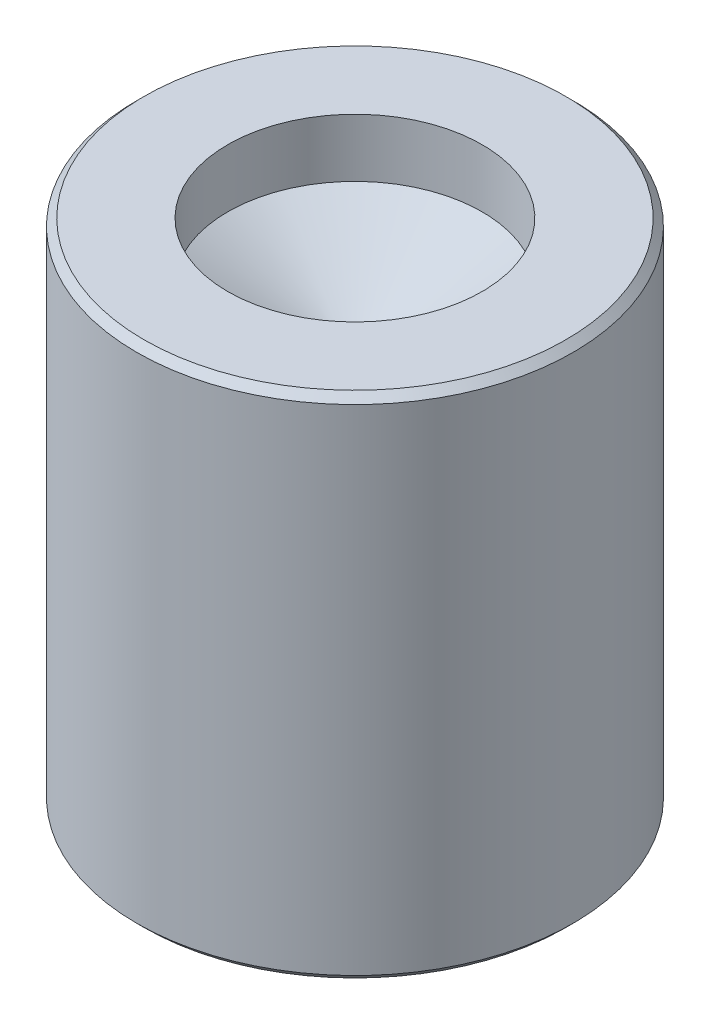
ISO-10303-21;
HEADER;
FILE_DESCRIPTION(('STEP AP214'),'2;1');
FILE_NAME('part.step','',(''),(''),'','','');
FILE_SCHEMA(('AUTOMOTIVE_DESIGN { 1 0 10303 214 1 1 1 1 }'));
ENDSEC;
DATA;
#1=APPLICATION_CONTEXT('core data for automotive mechanical design processes');
#2=APPLICATION_PROTOCOL_DEFINITION('international standard','automotive_design',2000,#1);
#3=PRODUCT_CONTEXT('',#1,'mechanical');
#4=PRODUCT('Part','Part','',(#3));
#5=PRODUCT_RELATED_PRODUCT_CATEGORY('part','',(#4));
#6=PRODUCT_DEFINITION_FORMATION('','',#4);
#7=PRODUCT_DEFINITION_CONTEXT('part definition',#1,'design');
#8=PRODUCT_DEFINITION('design','',#6,#7);
#9=PRODUCT_DEFINITION_SHAPE('','',#8);
#10=(LENGTH_UNIT() NAMED_UNIT(*) SI_UNIT(.MILLI.,.METRE.));
#11=(NAMED_UNIT(*) PLANE_ANGLE_UNIT() SI_UNIT($,.RADIAN.));
#12=(NAMED_UNIT(*) SI_UNIT($,.STERADIAN.) SOLID_ANGLE_UNIT());
#13=UNCERTAINTY_MEASURE_WITH_UNIT(LENGTH_MEASURE(1.E-05),#10,'distance_accuracy_value','');
#14=(GEOMETRIC_REPRESENTATION_CONTEXT(3) GLOBAL_UNCERTAINTY_ASSIGNED_CONTEXT((#13)) GLOBAL_UNIT_ASSIGNED_CONTEXT((#10,
#11,#12)) REPRESENTATION_CONTEXT('',''));
#15=CARTESIAN_POINT('',(0.,0.,0.));
#16=DIRECTION('',(0.,0.,1.));
#17=DIRECTION('',(1.,0.,0.));
#18=AXIS2_PLACEMENT_3D('',#15,#16,#17);
#19=CARTESIAN_POINT('',(0.,70.,0.));
#20=DIRECTION('',(0.,-1.,0.));
#21=DIRECTION('',(0.,0.,-1.));
#22=AXIS2_PLACEMENT_3D('',#19,#20,#21);
#23=CYLINDRICAL_SURFACE('',#22,30.);
#24=CARTESIAN_POINT('',(0.,0.999999999999987,0.));
#25=DIRECTION('',(0.,1.,0.));
#26=DIRECTION('',(0.,0.,1.));
#27=AXIS2_PLACEMENT_3D('',#24,#25,#26);
#28=CIRCLE('',#27,30.);
#29=CARTESIAN_POINT('',(0.,0.999999999999987,30.));
#30=VERTEX_POINT('',#29);
#31=EDGE_CURVE('E57',#30,#30,#28,.T.);
#32=ORIENTED_EDGE('',*,*,#31,.T.);
#33=EDGE_LOOP('',(#32));
#34=FACE_BOUND('',#33,.T.);
#35=CARTESIAN_POINT('',(0.,69.,0.));
#36=DIRECTION('',(0.,1.,0.));
#37=DIRECTION('',(0.,0.,1.));
#38=AXIS2_PLACEMENT_3D('',#35,#36,#37);
#39=CIRCLE('',#38,30.);
#40=CARTESIAN_POINT('',(0.,69.,30.));
#41=VERTEX_POINT('',#40);
#42=EDGE_CURVE('E53',#41,#41,#39,.F.);
#43=ORIENTED_EDGE('',*,*,#42,.T.);
#44=EDGE_LOOP('',(#43));
#45=FACE_BOUND('',#44,.T.);
#46=ADVANCED_FACE('F33',(#34,#45),#23,.T.);
#47=CARTESIAN_POINT('',(0.,70.,0.));
#48=DIRECTION('',(0.,1.,0.));
#49=DIRECTION('',(0.,0.,1.));
#50=AXIS2_PLACEMENT_3D('',#47,#48,#49);
#51=PLANE('',#50);
#52=CARTESIAN_POINT('',(0.,70.,0.));
#53=DIRECTION('',(0.,1.,0.));
#54=DIRECTION('',(0.,0.,1.));
#55=AXIS2_PLACEMENT_3D('',#52,#53,#54);
#56=CIRCLE('',#55,29.);
#57=CARTESIAN_POINT('',(0.,70.,29.));
#58=VERTEX_POINT('',#57);
#59=EDGE_CURVE('E11',#58,#58,#56,.T.);
#60=ORIENTED_EDGE('',*,*,#59,.T.);
#61=EDGE_LOOP('',(#60));
#62=FACE_BOUND('',#61,.T.);
#63=CARTESIAN_POINT('',(0.,70.,0.));
#64=DIRECTION('',(0.,1.,0.));
#65=DIRECTION('',(0.,0.,1.));
#66=AXIS2_PLACEMENT_3D('',#63,#64,#65);
#67=CIRCLE('',#66,17.500000052);
#68=CARTESIAN_POINT('',(0.,70.,17.500000052));
#69=VERTEX_POINT('',#68);
#70=EDGE_CURVE('E54',#69,#69,#67,.T.);
#71=ORIENTED_EDGE('',*,*,#70,.F.);
#72=EDGE_LOOP('',(#71));
#73=FACE_BOUND('',#72,.T.);
#74=ADVANCED_FACE('F74',(#62,#73),#51,.T.);
#75=CARTESIAN_POINT('',(0.,0.,0.));
#76=DIRECTION('',(0.,1.,0.));
#77=DIRECTION('',(0.,0.,1.));
#78=AXIS2_PLACEMENT_3D('',#75,#76,#77);
#79=PLANE('',#78);
#80=CARTESIAN_POINT('',(0.,0.,0.));
#81=DIRECTION('',(0.,1.,0.));
#82=DIRECTION('',(0.,0.,1.));
#83=AXIS2_PLACEMENT_3D('',#80,#81,#82);
#84=CIRCLE('',#83,29.);
#85=CARTESIAN_POINT('',(0.,0.,29.));
#86=VERTEX_POINT('',#85);
#87=EDGE_CURVE('E40',#86,#86,#84,.F.);
#88=ORIENTED_EDGE('',*,*,#87,.T.);
#89=EDGE_LOOP('',(#88));
#90=FACE_BOUND('',#89,.T.);
#91=ADVANCED_FACE('F47',(#90),#79,.F.);
#92=CARTESIAN_POINT('',(0.,62.,0.));
#93=DIRECTION('',(0.,1.,0.));
#94=DIRECTION('',(0.,0.,1.));
#95=AXIS2_PLACEMENT_3D('',#92,#93,#94);
#96=CONICAL_SURFACE('',#95,17.500000052,1.02974425867665);
#97=CARTESIAN_POINT('',(0.,51.484939135773,0.));
#98=VERTEX_POINT('',#97);
#99=VERTEX_LOOP('',#98);
#100=FACE_BOUND('',#99,.T.);
#101=CARTESIAN_POINT('',(0.,62.,0.));
#102=DIRECTION('',(0.,1.,0.));
#103=DIRECTION('',(0.,0.,1.));
#104=AXIS2_PLACEMENT_3D('',#101,#102,#103);
#105=CIRCLE('',#104,17.500000052);
#106=CARTESIAN_POINT('',(0.,62.,17.500000052));
#107=VERTEX_POINT('',#106);
#108=EDGE_CURVE('E51',#107,#107,#105,.T.);
#109=ORIENTED_EDGE('',*,*,#108,.T.);
#110=EDGE_LOOP('',(#109));
#111=FACE_BOUND('',#110,.T.);
#112=ADVANCED_FACE('F43',(#100,#111),#96,.F.);
#113=CARTESIAN_POINT('',(0.,70.,0.));
#114=DIRECTION('',(0.,1.,0.));
#115=DIRECTION('',(0.,0.,1.));
#116=AXIS2_PLACEMENT_3D('',#113,#114,#115);
#117=CYLINDRICAL_SURFACE('',#116,17.500000052);
#118=ORIENTED_EDGE('',*,*,#108,.F.);
#119=EDGE_LOOP('',(#118));
#120=FACE_BOUND('',#119,.T.);
#121=ORIENTED_EDGE('',*,*,#70,.T.);
#122=EDGE_LOOP('',(#121));
#123=FACE_BOUND('',#122,.T.);
#124=ADVANCED_FACE('F46',(#120,#123),#117,.F.);
#125=CARTESIAN_POINT('',(0.,0.999999999999987,0.));
#126=DIRECTION('',(0.,1.,0.));
#127=DIRECTION('',(0.,0.,1.));
#128=AXIS2_PLACEMENT_3D('',#125,#126,#127);
#129=CONICAL_SURFACE('',#128,30.,0.785398163397447);
#130=ORIENTED_EDGE('',*,*,#87,.F.);
#131=EDGE_LOOP('',(#130));
#132=FACE_BOUND('',#131,.T.);
#133=ORIENTED_EDGE('',*,*,#31,.F.);
#134=EDGE_LOOP('',(#133));
#135=FACE_BOUND('',#134,.T.);
#136=ADVANCED_FACE('F67',(#132,#135),#129,.T.);
#137=CARTESIAN_POINT('',(0.,70.,0.));
#138=DIRECTION('',(0.,-1.,0.));
#139=DIRECTION('',(0.,0.,-1.));
#140=AXIS2_PLACEMENT_3D('',#137,#138,#139);
#141=CONICAL_SURFACE('',#140,29.,0.785398163397443);
#142=ORIENTED_EDGE('',*,*,#42,.F.);
#143=EDGE_LOOP('',(#142));
#144=FACE_BOUND('',#143,.T.);
#145=ORIENTED_EDGE('',*,*,#59,.F.);
#146=EDGE_LOOP('',(#145));
#147=FACE_BOUND('',#146,.T.);
#148=ADVANCED_FACE('F35',(#144,#147),#141,.T.);
#149=CLOSED_SHELL('',(#46,#74,#91,#112,#124,#136,#148));
#150=MANIFOLD_SOLID_BREP('B2',#149);
#151=ADVANCED_BREP_SHAPE_REPRESENTATION('',(#18,#150),#14);
#152=SHAPE_DEFINITION_REPRESENTATION(#9,#151);
ENDSEC;
END-ISO-10303-21;
